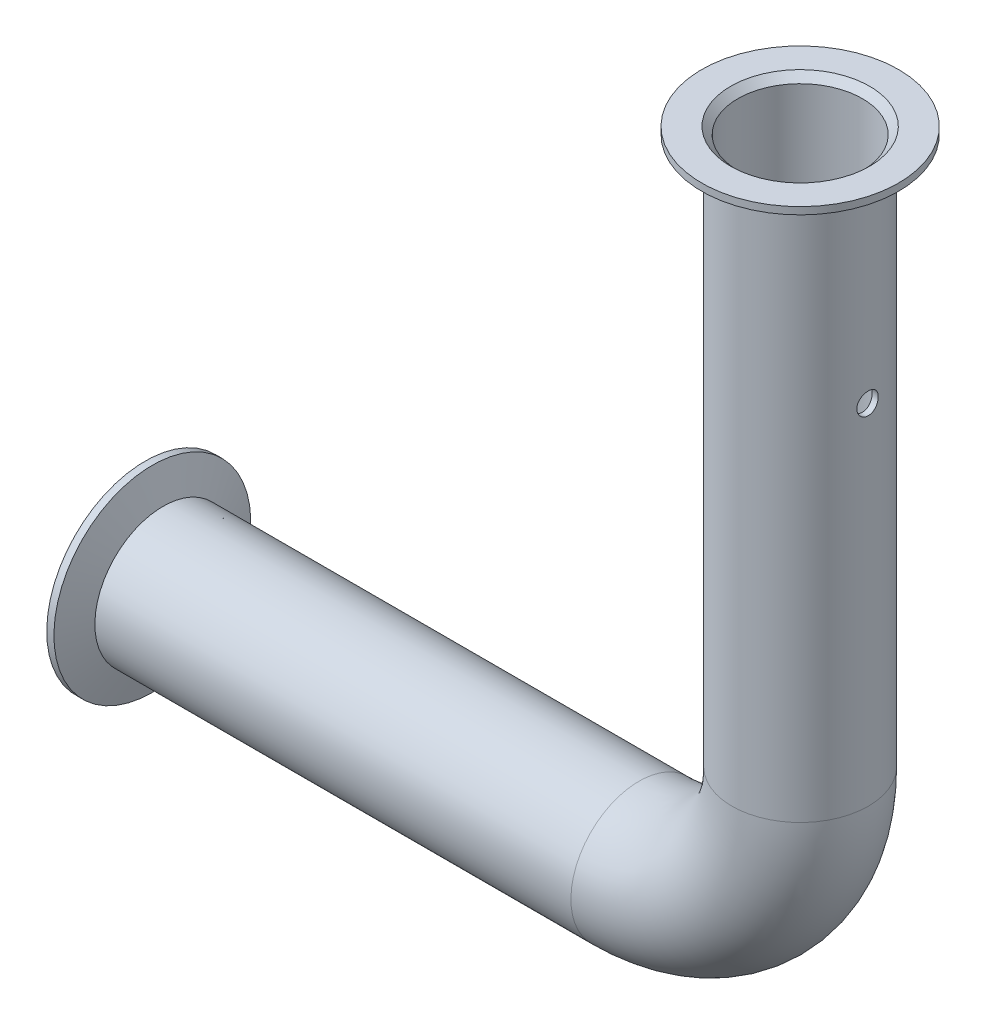
ISO-10303-21;
HEADER;
FILE_DESCRIPTION(('STEP AP214'),'2;1');
FILE_NAME('part.step','',(''),(''),'','','');
FILE_SCHEMA(('AUTOMOTIVE_DESIGN { 1 0 10303 214 1 1 1 1 }'));
ENDSEC;
DATA;
#1=APPLICATION_CONTEXT('core data for automotive mechanical design processes');
#2=APPLICATION_PROTOCOL_DEFINITION('international standard','automotive_design',2000,#1);
#3=PRODUCT_CONTEXT('',#1,'mechanical');
#4=PRODUCT('Part','Part','',(#3));
#5=PRODUCT_RELATED_PRODUCT_CATEGORY('part','',(#4));
#6=PRODUCT_DEFINITION_FORMATION('','',#4);
#7=PRODUCT_DEFINITION_CONTEXT('part definition',#1,'design');
#8=PRODUCT_DEFINITION('design','',#6,#7);
#9=PRODUCT_DEFINITION_SHAPE('','',#8);
#10=(LENGTH_UNIT() NAMED_UNIT(*) SI_UNIT(.MILLI.,.METRE.));
#11=(NAMED_UNIT(*) PLANE_ANGLE_UNIT() SI_UNIT($,.RADIAN.));
#12=(NAMED_UNIT(*) SI_UNIT($,.STERADIAN.) SOLID_ANGLE_UNIT());
#13=UNCERTAINTY_MEASURE_WITH_UNIT(LENGTH_MEASURE(1.E-05),#10,'distance_accuracy_value','');
#14=(GEOMETRIC_REPRESENTATION_CONTEXT(3) GLOBAL_UNCERTAINTY_ASSIGNED_CONTEXT((#13)) GLOBAL_UNIT_ASSIGNED_CONTEXT((#10,
#11,#12)) REPRESENTATION_CONTEXT('',''));
#15=CARTESIAN_POINT('',(0.,0.,0.));
#16=DIRECTION('',(0.,0.,1.));
#17=DIRECTION('',(1.,0.,0.));
#18=AXIS2_PLACEMENT_3D('',#15,#16,#17);
#19=CARTESIAN_POINT('',(0.,0.,0.));
#20=DIRECTION('',(1.,0.,0.));
#21=DIRECTION('',(0.,0.,-1.));
#22=AXIS2_PLACEMENT_3D('',#19,#20,#21);
#23=CYLINDRICAL_SURFACE('',#22,19.05);
#24=CARTESIAN_POINT('',(133.,0.,0.));
#25=DIRECTION('',(1.,0.,0.));
#26=DIRECTION('',(0.,0.,-1.));
#27=AXIS2_PLACEMENT_3D('',#24,#25,#26);
#28=CIRCLE('',#27,19.05);
#29=CARTESIAN_POINT('',(133.,-19.05,0.));
#30=VERTEX_POINT('',#29);
#31=EDGE_CURVE('E137',#30,#30,#28,.T.);
#32=ORIENTED_EDGE('',*,*,#31,.F.);
#33=EDGE_LOOP('',(#32));
#34=FACE_BOUND('',#33,.T.);
#35=CARTESIAN_POINT('',(0.,0.,0.));
#36=DIRECTION('',(-1.,0.,0.));
#37=DIRECTION('',(0.,-1.,0.));
#38=AXIS2_PLACEMENT_3D('',#35,#36,#37);
#39=CIRCLE('',#38,19.05);
#40=CARTESIAN_POINT('',(0.,-19.05,0.));
#41=VERTEX_POINT('',#40);
#42=EDGE_CURVE('E140',#41,#41,#39,.T.);
#43=ORIENTED_EDGE('',*,*,#42,.F.);
#44=EDGE_LOOP('',(#43));
#45=FACE_BOUND('',#44,.T.);
#46=ADVANCED_FACE('F43',(#34,#45),#23,.T.);
#47=CARTESIAN_POINT('',(133.,45.,0.));
#48=DIRECTION('',(0.,0.,1.));
#49=DIRECTION('',(1.,0.,0.));
#50=AXIS2_PLACEMENT_3D('',#47,#48,#49);
#51=TOROIDAL_SURFACE('',#50,45.,19.05);
#52=CARTESIAN_POINT('',(178.,45.,0.));
#53=DIRECTION('',(0.,1.,0.));
#54=DIRECTION('',(0.,0.,-1.));
#55=AXIS2_PLACEMENT_3D('',#52,#53,#54);
#56=CIRCLE('',#55,19.05);
#57=CARTESIAN_POINT('',(197.05,45.,0.));
#58=VERTEX_POINT('',#57);
#59=EDGE_CURVE('E133',#58,#58,#56,.T.);
#60=CARTESIAN_POINT('',(133.,45.,0.));
#61=DIRECTION('',(0.,0.,1.));
#62=DIRECTION('',(1.,0.,0.));
#63=AXIS2_PLACEMENT_3D('',#60,#61,#62);
#64=CIRCLE('',#63,64.05);
#65=EDGE_CURVE('',#30,#58,#64,.T.);
#66=ORIENTED_EDGE('',*,*,#31,.T.);
#67=ORIENTED_EDGE('',*,*,#59,.F.);
#68=ORIENTED_EDGE('',*,*,#65,.T.);
#69=ORIENTED_EDGE('',*,*,#65,.F.);
#70=EDGE_LOOP('',(#66,#68,#67,#69));
#71=FACE_BOUND('',#70,.T.);
#72=ADVANCED_FACE('F103',(#71),#51,.T.);
#73=CARTESIAN_POINT('',(178.,45.,0.));
#74=DIRECTION('',(0.,1.,0.));
#75=DIRECTION('',(0.,0.,1.));
#76=AXIS2_PLACEMENT_3D('',#73,#74,#75);
#77=CYLINDRICAL_SURFACE('',#76,19.05);
#78=CARTESIAN_POINT('',(159.187703489473,142.5,-3.));
#79=CARTESIAN_POINT('',(159.187700586577,142.332613513148,-2.99999316428225));
#80=CARTESIAN_POINT('',(159.185445263211,142.165132367923,-2.9859434783189));
#81=CARTESIAN_POINT('',(159.176674678378,141.834859918439,-2.93013500745088));
#82=CARTESIAN_POINT('',(159.170155360748,141.672073233928,-2.88834983836782));
#83=CARTESIAN_POINT('',(159.153613071349,141.356017752674,-2.77835774833509));
#84=CARTESIAN_POINT('',(159.143592893292,141.202741481065,-2.71017189064484));
#85=CARTESIAN_POINT('',(159.121181213352,140.909824846987,-2.54936485595133));
#86=CARTESIAN_POINT('',(159.108790011902,140.770182760313,-2.45674677419412));
#87=CARTESIAN_POINT('',(159.082910404004,140.507248374502,-2.24883318432544));
#88=CARTESIAN_POINT('',(159.069414117387,140.384093657118,-2.13336464402717));
#89=CARTESIAN_POINT('',(159.042915216298,140.158823383707,-1.883401654284));
#90=CARTESIAN_POINT('',(159.029912629912,140.056709023192,-1.74890612446042));
#91=CARTESIAN_POINT('',(159.005783291486,139.875906572666,-1.46382107591253));
#92=CARTESIAN_POINT('',(158.994666868924,139.797345781841,-1.31314987452316));
#93=CARTESIAN_POINT('',(158.975649841318,139.666698012562,-1.00054606276505));
#94=CARTESIAN_POINT('',(158.967749049329,139.614609495046,-0.838614107703246));
#95=CARTESIAN_POINT('',(158.956109097804,139.538803612335,-0.509504458961661));
#96=CARTESIAN_POINT('',(158.952336108274,139.514855496496,-0.342381131449638));
#97=CARTESIAN_POINT('',(158.949260803725,139.495293265373,-0.00644854828947677));
#98=CARTESIAN_POINT('',(158.949958216015,139.499677421839,0.162360603897239));
#99=CARTESIAN_POINT('',(158.955718214783,139.536474122161,0.495297170001354));
#100=CARTESIAN_POINT('',(158.960742131705,139.568638379651,0.659452789221933));
#101=CARTESIAN_POINT('',(158.974547566812,139.659691989148,0.980007386693285));
#102=CARTESIAN_POINT('',(158.983329189611,139.718582085194,1.13640614886079));
#103=CARTESIAN_POINT('',(159.003729538774,139.861666627902,1.43775322360427));
#104=CARTESIAN_POINT('',(159.015359838447,139.945964629633,1.58265155114625));
#105=CARTESIAN_POINT('',(159.040163103409,140.137396355433,1.85633969592821));
#106=CARTESIAN_POINT('',(159.05333618041,140.244531733609,1.98512834527474));
#107=CARTESIAN_POINT('',(159.079926174403,140.47997756032,2.22440636122582));
#108=CARTESIAN_POINT('',(159.093344186862,140.608504888794,2.33468230720354));
#109=CARTESIAN_POINT('',(159.118773029415,140.882352017071,2.53213541538373));
#110=CARTESIAN_POINT('',(159.130783849078,141.027671941353,2.61931240634407));
#111=CARTESIAN_POINT('',(159.15203848251,141.331212530708,2.76812750392854));
#112=CARTESIAN_POINT('',(159.161279739996,141.489444943599,2.82974203664829));
#113=CARTESIAN_POINT('',(159.175905021558,141.814190817107,2.92545981632354));
#114=CARTESIAN_POINT('',(159.181289346822,141.980703630019,2.95956521149952));
#115=CARTESIAN_POINT('',(159.187533488768,142.315380111018,2.99900048336458));
#116=CARTESIAN_POINT('',(159.188440988554,142.483507184047,3.00463363662459));
#117=CARTESIAN_POINT('',(159.185755503355,142.818303285936,2.98777075896833));
#118=CARTESIAN_POINT('',(159.182162672844,142.984972364644,2.96527569355988));
#119=CARTESIAN_POINT('',(159.17092526081,143.31117142179,2.89305274696528));
#120=CARTESIAN_POINT('',(159.163303379441,143.470736020501,2.84347738772256));
#121=CARTESIAN_POINT('',(159.14488552162,143.779291509504,2.71866034112186));
#122=CARTESIAN_POINT('',(159.134089373811,143.928281828427,2.64341726811573));
#123=CARTESIAN_POINT('',(159.11042777006,144.212814723465,2.4686776397812));
#124=CARTESIAN_POINT('',(159.097545936854,144.348235876118,2.36898562424281));
#125=CARTESIAN_POINT('',(159.071213116888,144.600535011523,2.14844821338371));
#126=CARTESIAN_POINT('',(159.057762094579,144.717411833873,2.02760149531243));
#127=CARTESIAN_POINT('',(159.031656670822,144.930401742671,1.76684593336909));
#128=CARTESIAN_POINT('',(159.019010765205,145.026313286635,1.62677148826422));
#129=CARTESIAN_POINT('',(158.996074283634,145.193242617503,1.332322319602));
#130=CARTESIAN_POINT('',(158.985783637988,145.264261141027,1.17794801936915));
#131=CARTESIAN_POINT('',(158.968754245917,145.379070102062,0.859897155614237));
#132=CARTESIAN_POINT('',(158.96200141097,145.42296866582,0.696260409581024));
#133=CARTESIAN_POINT('',(158.952749175034,145.482640779654,0.363823114579264));
#134=CARTESIAN_POINT('',(158.950249463099,145.498416385798,0.195022944026266));
#135=CARTESIAN_POINT('',(158.949788796469,145.501340666931,-0.14099902016026));
#136=CARTESIAN_POINT('',(158.951779069629,145.488796957368,-0.308218150586969));
#137=CARTESIAN_POINT('',(158.959975871122,145.436100652914,-0.638137125025831));
#138=CARTESIAN_POINT('',(158.966182381759,145.395948173898,-0.80083698800262));
#139=CARTESIAN_POINT('',(158.982117247542,145.289287189604,-1.11700004322183));
#140=CARTESIAN_POINT('',(158.991842470978,145.222802115795,-1.27047130786108));
#141=CARTESIAN_POINT('',(159.013749443631,145.065396608446,-1.56412817940785));
#142=CARTESIAN_POINT('',(159.025931288819,144.974475220239,-1.70431326696784));
#143=CARTESIAN_POINT('',(159.051556111793,144.769675110238,-1.96897416721851));
#144=CARTESIAN_POINT('',(159.065010764277,144.655570045303,-2.09327371794958));
#145=CARTESIAN_POINT('',(159.091580860866,144.408117616004,-2.32107137409755));
#146=CARTESIAN_POINT('',(159.104696224729,144.274765748005,-2.42456459735867));
#147=CARTESIAN_POINT('',(159.129190844939,143.991621612932,-2.60839822823119));
#148=CARTESIAN_POINT('',(159.140558753441,143.841731920204,-2.68859008291808));
#149=CARTESIAN_POINT('',(159.160137893067,143.530497730829,-2.82253743997057));
#150=CARTESIAN_POINT('',(159.168352345031,143.369165122282,-2.87631993177378));
#151=CARTESIAN_POINT('',(159.178829693885,143.089290764371,-2.94394424750404));
#152=CARTESIAN_POINT('',(159.18213935215,142.972463339834,-2.96493231641221));
#153=CARTESIAN_POINT('',(159.186577261681,142.737106427299,-2.99296250857308));
#154=CARTESIAN_POINT('',(159.187705545891,142.618576965033,-3.00000484243788));
#155=CARTESIAN_POINT('',(159.187703489473,142.5,-3.));
#156=B_SPLINE_CURVE_WITH_KNOTS('',3,(#78,#79,#80,#81,#82,#83,#84,#85,#86,#87,#88,#89,#90,#91,
#92,#93,#94,#95,#96,#97,#98,#99,#100,#101,#102,#103,#104,#105,#106,#107,#108,#109,#110,#111,
#112,#113,#114,#115,#116,#117,#118,#119,#120,#121,#122,#123,#124,#125,#126,#127,#128,#129,#130,
#131,#132,#133,#134,#135,#136,#137,#138,#139,#140,#141,#142,#143,#144,#145,#146,#147,#148,#149,
#150,#151,#152,#153,#154,#155),.UNSPECIFIED.,.T.,.F.,(4,2,2,2,2,2,2,2,2,2,2,2,2,2,2,2,2,2,2,2,2,
2,2,2,2,2,2,2,2,2,2,2,2,2,2,2,2,2,4),(0.,0.50172596184403,1.0039298903153,1.50573396835043,
2.00747450481917,2.51317076986734,3.01889576057936,3.52730669699158,4.03568807171937,
4.53987097764248,5.04402312901724,5.54371547542915,6.04342173399369,6.54519283818574,
7.04700029791245,7.55424551881871,8.0614945000388,8.56921023606641,9.07688632014357,
9.57914324416357,10.0813829285681,10.5808226297516,11.0802892970004,11.5838872048831,
12.0875166127364,12.5957931165224,13.1040545783955,13.6102763177623,14.1164610457681,
14.6171738846743,15.1178846220737,15.618150810642,16.1184365462134,16.6238640372158,
17.1294099875213,17.6381115698749,18.1462921895268,18.5017213609858,18.8571451646203),.UNSPECIFIED.);
#157=CARTESIAN_POINT('',(159.187703489473,142.5,-3.));
#158=VERTEX_POINT('',#157);
#159=EDGE_CURVE('E93',#158,#158,#156,.T.);
#160=ORIENTED_EDGE('',*,*,#159,.F.);
#161=EDGE_LOOP('',(#160));
#162=FACE_BOUND('',#161,.T.);
#163=CARTESIAN_POINT('',(196.812296510527,142.5,-3.));
#164=CARTESIAN_POINT('',(196.812299413423,142.667386486852,-2.99999316428225));
#165=CARTESIAN_POINT('',(196.814554736789,142.834867632077,-2.9859434783189));
#166=CARTESIAN_POINT('',(196.823325321622,143.165140081561,-2.93013500745088));
#167=CARTESIAN_POINT('',(196.829844639252,143.327926766072,-2.88834983836782));
#168=CARTESIAN_POINT('',(196.846386928651,143.643982247326,-2.77835774833509));
#169=CARTESIAN_POINT('',(196.856407106708,143.797258518935,-2.71017189064484));
#170=CARTESIAN_POINT('',(196.878818786648,144.090175153013,-2.54936485595133));
#171=CARTESIAN_POINT('',(196.891209988098,144.229817239687,-2.45674677419412));
#172=CARTESIAN_POINT('',(196.917089595996,144.492751625498,-2.24883318432544));
#173=CARTESIAN_POINT('',(196.930585882612,144.615906342882,-2.13336464402717));
#174=CARTESIAN_POINT('',(196.957084783702,144.841176616293,-1.883401654284));
#175=CARTESIAN_POINT('',(196.970087370088,144.943290976808,-1.74890612446042));
#176=CARTESIAN_POINT('',(196.994216708514,145.124093427334,-1.46382107591253));
#177=CARTESIAN_POINT('',(197.005333131076,145.202654218159,-1.31314987452315));
#178=CARTESIAN_POINT('',(197.024350158682,145.333301987438,-1.00054606276505));
#179=CARTESIAN_POINT('',(197.032250950671,145.385390504954,-0.838614107703245));
#180=CARTESIAN_POINT('',(197.043890902196,145.461196387665,-0.509504458961662));
#181=CARTESIAN_POINT('',(197.047663891726,145.485144503504,-0.342381131449638));
#182=CARTESIAN_POINT('',(197.050739196275,145.504706734627,-0.00644854828947655));
#183=CARTESIAN_POINT('',(197.050041783985,145.500322578161,0.162360603897239));
#184=CARTESIAN_POINT('',(197.044281785217,145.463525877839,0.495297170001354));
#185=CARTESIAN_POINT('',(197.039257868295,145.431361620349,0.659452789221933));
#186=CARTESIAN_POINT('',(197.025452433188,145.340308010852,0.980007386693285));
#187=CARTESIAN_POINT('',(197.016670810389,145.281417914806,1.13640614886079));
#188=CARTESIAN_POINT('',(196.996270461226,145.138333372098,1.43775322360427));
#189=CARTESIAN_POINT('',(196.984640161553,145.054035370367,1.58265155114625));
#190=CARTESIAN_POINT('',(196.959836896591,144.862603644567,1.85633969592821));
#191=CARTESIAN_POINT('',(196.94666381959,144.755468266391,1.98512834527474));
#192=CARTESIAN_POINT('',(196.920073825597,144.520022439681,2.22440636122582));
#193=CARTESIAN_POINT('',(196.906655813138,144.391495111206,2.33468230720354));
#194=CARTESIAN_POINT('',(196.881226970585,144.117647982929,2.53213541538373));
#195=CARTESIAN_POINT('',(196.869216150922,143.972328058647,2.61931240634407));
#196=CARTESIAN_POINT('',(196.84796151749,143.668787469292,2.76812750392854));
#197=CARTESIAN_POINT('',(196.838720260004,143.510555056401,2.82974203664829));
#198=CARTESIAN_POINT('',(196.824094978442,143.185809182893,2.92545981632354));
#199=CARTESIAN_POINT('',(196.818710653178,143.019296369981,2.95956521149952));
#200=CARTESIAN_POINT('',(196.812466511232,142.684619888982,2.99900048336458));
#201=CARTESIAN_POINT('',(196.811559011446,142.516492815953,3.00463363662459));
#202=CARTESIAN_POINT('',(196.814244496645,142.181696714064,2.98777075896833));
#203=CARTESIAN_POINT('',(196.817837327156,142.015027635356,2.96527569355988));
#204=CARTESIAN_POINT('',(196.82907473919,141.68882857821,2.89305274696528));
#205=CARTESIAN_POINT('',(196.836696620559,141.529263979499,2.84347738772256));
#206=CARTESIAN_POINT('',(196.85511447838,141.220708490496,2.71866034112186));
#207=CARTESIAN_POINT('',(196.865910626189,141.071718171573,2.64341726811573));
#208=CARTESIAN_POINT('',(196.88957222994,140.787185276535,2.4686776397812));
#209=CARTESIAN_POINT('',(196.902454063146,140.651764123882,2.36898562424281));
#210=CARTESIAN_POINT('',(196.928786883112,140.399464988477,2.14844821338371));
#211=CARTESIAN_POINT('',(196.942237905421,140.282588166127,2.02760149531243));
#212=CARTESIAN_POINT('',(196.968343329178,140.06959825733,1.76684593336909));
#213=CARTESIAN_POINT('',(196.980989234795,139.973686713365,1.62677148826422));
#214=CARTESIAN_POINT('',(197.003925716366,139.806757382497,1.332322319602));
#215=CARTESIAN_POINT('',(197.014216362012,139.735738858973,1.17794801936915));
#216=CARTESIAN_POINT('',(197.031245754083,139.620929897938,0.859897155614237));
#217=CARTESIAN_POINT('',(197.03799858903,139.57703133418,0.696260409581024));
#218=CARTESIAN_POINT('',(197.047250824966,139.517359220346,0.363823114579264));
#219=CARTESIAN_POINT('',(197.049750536901,139.501583614202,0.195022944026266));
#220=CARTESIAN_POINT('',(197.050211203531,139.498659333069,-0.14099902016026));
#221=CARTESIAN_POINT('',(197.048220930371,139.511203042632,-0.308218150586969));
#222=CARTESIAN_POINT('',(197.040024128878,139.563899347086,-0.638137125025831));
#223=CARTESIAN_POINT('',(197.033817618241,139.604051826102,-0.80083698800262));
#224=CARTESIAN_POINT('',(197.017882752458,139.710712810396,-1.11700004322183));
#225=CARTESIAN_POINT('',(197.008157529022,139.777197884205,-1.27047130786108));
#226=CARTESIAN_POINT('',(196.986250556369,139.934603391554,-1.56412817940785));
#227=CARTESIAN_POINT('',(196.974068711181,140.025524779761,-1.70431326696784));
#228=CARTESIAN_POINT('',(196.948443888207,140.230324889762,-1.96897416721851));
#229=CARTESIAN_POINT('',(196.934989235723,140.344429954697,-2.09327371794958));
#230=CARTESIAN_POINT('',(196.908419139134,140.591882383996,-2.32107137409755));
#231=CARTESIAN_POINT('',(196.895303775271,140.725234251995,-2.42456459735867));
#232=CARTESIAN_POINT('',(196.870809155061,141.008378387068,-2.60839822823119));
#233=CARTESIAN_POINT('',(196.859441246559,141.158268079796,-2.68859008291808));
#234=CARTESIAN_POINT('',(196.839862106933,141.469502269171,-2.82253743997057));
#235=CARTESIAN_POINT('',(196.831647654969,141.630834877718,-2.87631993177378));
#236=CARTESIAN_POINT('',(196.821170306115,141.910709235629,-2.94394424750404));
#237=CARTESIAN_POINT('',(196.81786064785,142.027536660166,-2.96493231641221));
#238=CARTESIAN_POINT('',(196.813422738319,142.262893572701,-2.99296250857308));
#239=CARTESIAN_POINT('',(196.812294454109,142.381423034967,-3.00000484243788));
#240=CARTESIAN_POINT('',(196.812296510527,142.5,-3.));
#241=B_SPLINE_CURVE_WITH_KNOTS('',3,(#163,#164,#165,#166,#167,#168,#169,#170,#171,#172,#173,
#174,#175,#176,#177,#178,#179,#180,#181,#182,#183,#184,#185,#186,#187,#188,#189,#190,#191,#192,
#193,#194,#195,#196,#197,#198,#199,#200,#201,#202,#203,#204,#205,#206,#207,#208,#209,#210,#211,
#212,#213,#214,#215,#216,#217,#218,#219,#220,#221,#222,#223,#224,#225,#226,#227,#228,#229,#230,
#231,#232,#233,#234,#235,#236,#237,#238,#239,#240),.UNSPECIFIED.,.T.,.F.,(4,2,2,2,2,2,2,2,2,2,2,
2,2,2,2,2,2,2,2,2,2,2,2,2,2,2,2,2,2,2,2,2,2,2,2,2,2,2,4),(0.,0.50172596184403,1.0039298903153,
1.50573396835043,2.00747450481917,2.51317076986734,3.01889576057936,3.52730669699159,
4.03568807171937,4.53987097764248,5.04402312901724,5.54371547542915,6.04342173399369,
6.54519283818574,7.04700029791245,7.55424551881871,8.06149450003881,8.56921023606641,
9.07688632014357,9.57914324416358,10.0813829285681,10.5808226297516,11.0802892970004,
11.5838872048831,12.0875166127364,12.5957931165224,13.1040545783955,13.6102763177623,
14.1164610457681,14.6171738846743,15.1178846220737,15.6181508106421,16.1184365462134,
16.6238640372158,17.1294099875213,17.6381115698749,18.1462921895268,18.5017213609858,
18.8571451646203),.UNSPECIFIED.);
#242=CARTESIAN_POINT('',(196.812296510527,142.5,-3.));
#243=VERTEX_POINT('',#242);
#244=EDGE_CURVE('E87',#243,#243,#241,.T.);
#245=ORIENTED_EDGE('',*,*,#244,.F.);
#246=EDGE_LOOP('',(#245));
#247=FACE_BOUND('',#246,.T.);
#248=CARTESIAN_POINT('',(178.,195.,0.));
#249=DIRECTION('',(0.,1.,0.));
#250=DIRECTION('',(0.,0.,-1.));
#251=AXIS2_PLACEMENT_3D('',#248,#249,#250);
#252=CIRCLE('',#251,19.05);
#253=CARTESIAN_POINT('',(178.,195.,-19.05));
#254=VERTEX_POINT('',#253);
#255=EDGE_CURVE('E136',#254,#254,#252,.T.);
#256=ORIENTED_EDGE('',*,*,#255,.F.);
#257=EDGE_LOOP('',(#256));
#258=FACE_BOUND('',#257,.T.);
#259=ORIENTED_EDGE('',*,*,#59,.T.);
#260=EDGE_LOOP('',(#259));
#261=FACE_BOUND('',#260,.T.);
#262=ADVANCED_FACE('F98',(#162,#247,#258,#261),#77,.T.);
#263=CARTESIAN_POINT('',(0.,0.,0.));
#264=DIRECTION('',(-1.,0.,0.));
#265=DIRECTION('',(0.,-1.,0.));
#266=AXIS2_PLACEMENT_3D('',#263,#264,#265);
#267=CONICAL_SURFACE('',#266,19.05,1.2296478530425);
#268=CARTESIAN_POINT('',(-3.,0.,0.));
#269=DIRECTION('',(-1.,0.,0.));
#270=DIRECTION('',(0.,-1.,0.));
#271=AXIS2_PLACEMENT_3D('',#268,#269,#270);
#272=CIRCLE('',#271,27.5);
#273=CARTESIAN_POINT('',(-3.,-27.5,0.));
#274=VERTEX_POINT('',#273);
#275=EDGE_CURVE('E147',#274,#274,#272,.T.);
#276=ORIENTED_EDGE('',*,*,#275,.F.);
#277=EDGE_LOOP('',(#276));
#278=FACE_BOUND('',#277,.T.);
#279=ORIENTED_EDGE('',*,*,#42,.T.);
#280=EDGE_LOOP('',(#279));
#281=FACE_BOUND('',#280,.T.);
#282=ADVANCED_FACE('F102',(#278,#281),#267,.T.);
#283=CARTESIAN_POINT('',(-5.,0.,0.));
#284=DIRECTION('',(-1.,0.,0.));
#285=DIRECTION('',(0.,-1.,0.));
#286=AXIS2_PLACEMENT_3D('',#283,#284,#285);
#287=CYLINDRICAL_SURFACE('',#286,27.5);
#288=CARTESIAN_POINT('',(-5.,0.,0.));
#289=DIRECTION('',(-1.,0.,0.));
#290=DIRECTION('',(0.,-1.,0.));
#291=AXIS2_PLACEMENT_3D('',#288,#289,#290);
#292=CIRCLE('',#291,27.5);
#293=CARTESIAN_POINT('',(-5.,-27.5,0.));
#294=VERTEX_POINT('',#293);
#295=EDGE_CURVE('E150',#294,#294,#292,.T.);
#296=ORIENTED_EDGE('',*,*,#295,.F.);
#297=EDGE_LOOP('',(#296));
#298=FACE_BOUND('',#297,.T.);
#299=ORIENTED_EDGE('',*,*,#275,.T.);
#300=EDGE_LOOP('',(#299));
#301=FACE_BOUND('',#300,.T.);
#302=ADVANCED_FACE('F179',(#298,#301),#287,.T.);
#303=CARTESIAN_POINT('',(-5.,27.5,0.));
#304=DIRECTION('',(1.,0.,0.));
#305=DIRECTION('',(0.,1.,0.));
#306=AXIS2_PLACEMENT_3D('',#303,#304,#305);
#307=PLANE('',#306);
#308=CARTESIAN_POINT('',(-5.,0.,0.));
#309=DIRECTION('',(1.,0.,0.));
#310=DIRECTION('',(0.,1.,0.));
#311=AXIS2_PLACEMENT_3D('',#308,#309,#310);
#312=CIRCLE('',#311,19.4);
#313=CARTESIAN_POINT('',(-5.,19.4,0.));
#314=VERTEX_POINT('',#313);
#315=EDGE_CURVE('E62',#314,#314,#312,.T.);
#316=ORIENTED_EDGE('',*,*,#315,.T.);
#317=EDGE_LOOP('',(#316));
#318=FACE_BOUND('',#317,.T.);
#319=ORIENTED_EDGE('',*,*,#295,.T.);
#320=EDGE_LOOP('',(#319));
#321=FACE_BOUND('',#320,.T.);
#322=ADVANCED_FACE('F186',(#318,#321),#307,.F.);
#323=CARTESIAN_POINT('',(178.,200.,0.));
#324=DIRECTION('',(0.,1.,0.));
#325=DIRECTION('',(0.,0.,1.));
#326=AXIS2_PLACEMENT_3D('',#323,#324,#325);
#327=PLANE('',#326);
#328=CARTESIAN_POINT('',(178.,200.,0.));
#329=DIRECTION('',(0.,1.,0.));
#330=DIRECTION('',(0.,0.,1.));
#331=AXIS2_PLACEMENT_3D('',#328,#329,#330);
#332=CIRCLE('',#331,19.4000000000001);
#333=CARTESIAN_POINT('',(178.,200.,19.4000000000001));
#334=VERTEX_POINT('',#333);
#335=EDGE_CURVE('E10',#334,#334,#332,.F.);
#336=ORIENTED_EDGE('',*,*,#335,.T.);
#337=EDGE_LOOP('',(#336));
#338=FACE_BOUND('',#337,.T.);
#339=CARTESIAN_POINT('',(178.,200.,0.));
#340=DIRECTION('',(0.,-1.,0.));
#341=DIRECTION('',(0.,0.,-1.));
#342=AXIS2_PLACEMENT_3D('',#339,#340,#341);
#343=CIRCLE('',#342,27.5);
#344=CARTESIAN_POINT('',(178.,200.,-27.5));
#345=VERTEX_POINT('',#344);
#346=EDGE_CURVE('E153',#345,#345,#343,.T.);
#347=ORIENTED_EDGE('',*,*,#346,.F.);
#348=EDGE_LOOP('',(#347));
#349=FACE_BOUND('',#348,.T.);
#350=ADVANCED_FACE('F248',(#338,#349),#327,.T.);
#351=CARTESIAN_POINT('',(178.,195.,0.));
#352=DIRECTION('',(0.,-1.,0.));
#353=DIRECTION('',(0.,0.,-1.));
#354=AXIS2_PLACEMENT_3D('',#351,#352,#353);
#355=CYLINDRICAL_SURFACE('',#354,27.5);
#356=ORIENTED_EDGE('',*,*,#346,.T.);
#357=EDGE_LOOP('',(#356));
#358=FACE_BOUND('',#357,.T.);
#359=CARTESIAN_POINT('',(178.,198.,0.));
#360=DIRECTION('',(0.,-1.,0.));
#361=DIRECTION('',(0.,0.,-1.));
#362=AXIS2_PLACEMENT_3D('',#359,#360,#361);
#363=CIRCLE('',#362,27.5);
#364=CARTESIAN_POINT('',(178.,198.,-27.5));
#365=VERTEX_POINT('',#364);
#366=EDGE_CURVE('E155',#365,#365,#363,.T.);
#367=ORIENTED_EDGE('',*,*,#366,.F.);
#368=EDGE_LOOP('',(#367));
#369=FACE_BOUND('',#368,.T.);
#370=ADVANCED_FACE('F256',(#358,#369),#355,.T.);
#371=CARTESIAN_POINT('',(178.,195.,0.));
#372=DIRECTION('',(0.,1.,0.));
#373=DIRECTION('',(0.,0.,1.));
#374=AXIS2_PLACEMENT_3D('',#371,#372,#373);
#375=CONICAL_SURFACE('',#374,19.05,1.2296478530425);
#376=ORIENTED_EDGE('',*,*,#366,.T.);
#377=EDGE_LOOP('',(#376));
#378=FACE_BOUND('',#377,.T.);
#379=ORIENTED_EDGE('',*,*,#255,.T.);
#380=EDGE_LOOP('',(#379));
#381=FACE_BOUND('',#380,.T.);
#382=ADVANCED_FACE('F80',(#378,#381),#375,.T.);
#383=CARTESIAN_POINT('',(0.,0.,0.));
#384=DIRECTION('',(1.,0.,0.));
#385=DIRECTION('',(0.,0.,-1.));
#386=AXIS2_PLACEMENT_3D('',#383,#384,#385);
#387=CYLINDRICAL_SURFACE('',#386,17.4);
#388=CARTESIAN_POINT('',(-3.00000000000002,0.,0.));
#389=DIRECTION('',(1.,0.,0.));
#390=DIRECTION('',(0.,0.,-1.));
#391=AXIS2_PLACEMENT_3D('',#388,#389,#390);
#392=CIRCLE('',#391,17.4);
#393=CARTESIAN_POINT('',(-3.00000000000002,0.,-17.4));
#394=VERTEX_POINT('',#393);
#395=EDGE_CURVE('E125',#394,#394,#392,.F.);
#396=ORIENTED_EDGE('',*,*,#395,.T.);
#397=EDGE_LOOP('',(#396));
#398=FACE_BOUND('',#397,.T.);
#399=CARTESIAN_POINT('',(133.,0.,0.));
#400=DIRECTION('',(1.,0.,0.));
#401=DIRECTION('',(0.,0.,-1.));
#402=AXIS2_PLACEMENT_3D('',#399,#400,#401);
#403=CIRCLE('',#402,17.4);
#404=CARTESIAN_POINT('',(133.,-17.4,0.));
#405=VERTEX_POINT('',#404);
#406=EDGE_CURVE('E130',#405,#405,#403,.F.);
#407=ORIENTED_EDGE('',*,*,#406,.F.);
#408=EDGE_LOOP('',(#407));
#409=FACE_BOUND('',#408,.T.);
#410=ADVANCED_FACE('F192',(#398,#409),#387,.F.);
#411=CARTESIAN_POINT('',(133.,45.,0.));
#412=DIRECTION('',(0.,0.,1.));
#413=DIRECTION('',(1.,0.,0.));
#414=AXIS2_PLACEMENT_3D('',#411,#412,#413);
#415=TOROIDAL_SURFACE('',#414,45.,17.4);
#416=CARTESIAN_POINT('',(178.,45.,0.));
#417=DIRECTION('',(0.,1.,0.));
#418=DIRECTION('',(0.,0.,-1.));
#419=AXIS2_PLACEMENT_3D('',#416,#417,#418);
#420=CIRCLE('',#419,17.4);
#421=CARTESIAN_POINT('',(195.4,45.,0.));
#422=VERTEX_POINT('',#421);
#423=EDGE_CURVE('E127',#422,#422,#420,.F.);
#424=CARTESIAN_POINT('',(133.,45.,0.));
#425=DIRECTION('',(0.,0.,1.));
#426=DIRECTION('',(1.,0.,0.));
#427=AXIS2_PLACEMENT_3D('',#424,#425,#426);
#428=CIRCLE('',#427,62.4);
#429=EDGE_CURVE('',#405,#422,#428,.T.);
#430=ORIENTED_EDGE('',*,*,#406,.T.);
#431=ORIENTED_EDGE('',*,*,#423,.F.);
#432=ORIENTED_EDGE('',*,*,#429,.T.);
#433=ORIENTED_EDGE('',*,*,#429,.F.);
#434=EDGE_LOOP('',(#430,#432,#431,#433));
#435=FACE_BOUND('',#434,.T.);
#436=ADVANCED_FACE('F118',(#435),#415,.F.);
#437=CARTESIAN_POINT('',(178.,45.,0.));
#438=DIRECTION('',(0.,1.,0.));
#439=DIRECTION('',(0.,0.,1.));
#440=AXIS2_PLACEMENT_3D('',#437,#438,#439);
#441=CYLINDRICAL_SURFACE('',#440,17.4);
#442=CARTESIAN_POINT('',(160.860571771497,142.5,-3.));
#443=CARTESIAN_POINT('',(160.860568686313,142.667162099753,-2.99999335724504));
#444=CARTESIAN_POINT('',(160.858099737712,142.834413351142,-2.98598107648695));
#445=CARTESIAN_POINT('',(160.848500572209,143.164216925406,-2.93033007499266));
#446=CARTESIAN_POINT('',(160.841366147984,143.326764868545,-2.88866641776324));
#447=CARTESIAN_POINT('',(160.823267544719,143.642341389074,-2.7790156991738));
#448=CARTESIAN_POINT('',(160.812306663912,143.795378031374,-2.71105130240584));
#449=CARTESIAN_POINT('',(160.787794060499,144.087861493786,-2.55078581397659));
#450=CARTESIAN_POINT('',(160.774242605691,144.227309716336,-2.45848723745745));
#451=CARTESIAN_POINT('',(160.745916174486,144.490142716688,-2.25113587305086));
#452=CARTESIAN_POINT('',(160.731130858211,144.613363478061,-2.13587656578704));
#453=CARTESIAN_POINT('',(160.702094345869,144.838817984968,-1.88632186548368));
#454=CARTESIAN_POINT('',(160.687843182379,144.94105045219,-1.75202531380507));
#455=CARTESIAN_POINT('',(160.661370897769,145.122245465277,-1.46714159110158));
#456=CARTESIAN_POINT('',(160.649163359464,145.201054820499,-1.31645561601985));
#457=CARTESIAN_POINT('',(160.628269031425,145.332181245278,-1.00373804855049));
#458=CARTESIAN_POINT('',(160.619581996853,145.384500157219,-0.841707246076585));
#459=CARTESIAN_POINT('',(160.606780474774,145.460657399248,-0.51259550662226));
#460=CARTESIAN_POINT('',(160.602621728107,145.484771576181,-0.345580151005187));
#461=CARTESIAN_POINT('',(160.599193166443,145.504693060338,-0.00982576970067351));
#462=CARTESIAN_POINT('',(160.599922996891,145.500502420442,0.158913130095934));
#463=CARTESIAN_POINT('',(160.606154440519,145.464147406612,0.49143718158875));
#464=CARTESIAN_POINT('',(160.611605405862,145.432279936818,0.655255879179156));
#465=CARTESIAN_POINT('',(160.626610099872,145.341943926314,0.975185404226671));
#466=CARTESIAN_POINT('',(160.636163960259,145.28347453157,1.13129598404231));
#467=CARTESIAN_POINT('',(160.658386802691,145.141302573686,1.43225507453539));
#468=CARTESIAN_POINT('',(160.671070713055,145.057478640159,1.57704510303452));
#469=CARTESIAN_POINT('',(160.698146145566,144.867066107597,1.8506157652878));
#470=CARTESIAN_POINT('',(160.712537815308,144.760475540292,1.97939501332025));
#471=CARTESIAN_POINT('',(160.741650395029,144.525911473752,2.21904409806251));
#472=CARTESIAN_POINT('',(160.756373153874,144.397678399926,2.32965979374928));
#473=CARTESIAN_POINT('',(160.784308467518,144.124341347122,2.5278474786494));
#474=CARTESIAN_POINT('',(160.797521006423,143.979237190615,2.61541922534721));
#475=CARTESIAN_POINT('',(160.820941345576,143.675971086589,2.76508902583851));
#476=CARTESIAN_POINT('',(160.831145335155,143.517792901075,2.82715481227661));
#477=CARTESIAN_POINT('',(160.847331537515,143.193040148825,2.92376252990049));
#478=CARTESIAN_POINT('',(160.853314149851,143.026466378336,2.95830706603273));
#479=CARTESIAN_POINT('',(160.860302432344,142.691929471287,2.9985303541063));
#480=CARTESIAN_POINT('',(160.861370690698,142.524011250249,3.00457213668238));
#481=CARTESIAN_POINT('',(160.858576225316,142.189563602633,2.98858735020478));
#482=CARTESIAN_POINT('',(160.85471370602,142.023034118763,2.96656194487535));
#483=CARTESIAN_POINT('',(160.842550845552,141.697254911017,2.89537809899298));
#484=CARTESIAN_POINT('',(160.834280978182,141.537963253417,2.84640590248255));
#485=CARTESIAN_POINT('',(160.814260977332,141.229847294372,2.72291454529328));
#486=CARTESIAN_POINT('',(160.802510622625,141.081023659035,2.64839376065669));
#487=CARTESIAN_POINT('',(160.776708953608,140.796456929061,2.47506944224903));
#488=CARTESIAN_POINT('',(160.762636132057,140.660856984217,2.37603414278919));
#489=CARTESIAN_POINT('',(160.733837438016,140.40806986812,2.15680866369819));
#490=CARTESIAN_POINT('',(160.719111516299,140.290884087833,2.03661688740501));
#491=CARTESIAN_POINT('',(160.690467048021,140.07691803837,1.77687839501271));
#492=CARTESIAN_POINT('',(160.676559362151,139.980380420645,1.63713040748836));
#493=CARTESIAN_POINT('',(160.6512948006,139.812154077889,1.34318887931082));
#494=CARTESIAN_POINT('',(160.639937838026,139.740464506338,1.18899583099853));
#495=CARTESIAN_POINT('',(160.621101417702,139.624343085256,0.871248610545507));
#496=CARTESIAN_POINT('',(160.613604217505,139.579786336223,0.707741180390293));
#497=CARTESIAN_POINT('',(160.603256859068,139.518794058127,0.375423922002362));
#498=CARTESIAN_POINT('',(160.600406290437,139.502356045603,0.206614563379787));
#499=CARTESIAN_POINT('',(160.599679801816,139.498143301673,-0.129176685642755));
#500=CARTESIAN_POINT('',(160.601739932249,139.510000103339,-0.296153928928437));
#501=CARTESIAN_POINT('',(160.61047220223,139.561240787417,-0.625700411283112));
#502=CARTESIAN_POINT('',(160.617144311415,139.600624488607,-0.788269679364498));
#503=CARTESIAN_POINT('',(160.634352935991,139.705655848456,-1.10423036972656));
#504=CARTESIAN_POINT('',(160.644884530097,139.771270069836,-1.2576331918238));
#505=CARTESIAN_POINT('',(160.668665022481,139.926858125833,-1.55130884583338));
#506=CARTESIAN_POINT('',(160.681914064025,140.016833244852,-1.69158098491987));
#507=CARTESIAN_POINT('',(160.709866551659,140.21988534551,-1.95686448300168));
#508=CARTESIAN_POINT('',(160.724585794082,140.333231232456,-2.08166837611875));
#509=CARTESIAN_POINT('',(160.753712987405,140.579244455275,-2.3106140598353));
#510=CARTESIAN_POINT('',(160.768120864561,140.711916311962,-2.41475100243274));
#511=CARTESIAN_POINT('',(160.795113177188,140.994020773316,-2.60014194329311));
#512=CARTESIAN_POINT('',(160.807682855311,141.14357357989,-2.68121521383318));
#513=CARTESIAN_POINT('',(160.829400451144,141.454334860905,-2.81696232305056));
#514=CARTESIAN_POINT('',(160.838551735728,141.615531679031,-2.87166215322099));
#515=CARTESIAN_POINT('',(160.850398678111,141.897764938873,-2.94143011247902));
#516=CARTESIAN_POINT('',(160.854192000948,142.017106496306,-2.96335795827201));
#517=CARTESIAN_POINT('',(160.859279640824,142.257616434661,-2.9926451623756));
#518=CARTESIAN_POINT('',(160.860574008675,142.378784778388,-3.00000481689939));
#519=CARTESIAN_POINT('',(160.860571771497,142.5,-3.));
#520=B_SPLINE_CURVE_WITH_KNOTS('',3,(#442,#443,#444,#445,#446,#447,#448,#449,#450,#451,#452,
#453,#454,#455,#456,#457,#458,#459,#460,#461,#462,#463,#464,#465,#466,#467,#468,#469,#470,#471,
#472,#473,#474,#475,#476,#477,#478,#479,#480,#481,#482,#483,#484,#485,#486,#487,#488,#489,#490,
#491,#492,#493,#494,#495,#496,#497,#498,#499,#500,#501,#502,#503,#504,#505,#506,#507,#508,#509,
#510,#511,#512,#513,#514,#515,#516,#517,#518,#519),.UNSPECIFIED.,.T.,.F.,(4,2,2,2,2,2,2,2,2,2,2,
2,2,2,2,2,2,2,2,2,2,2,2,2,2,2,2,2,2,2,2,2,2,2,2,2,2,2,4),(0.,0.501042953696751,1.00253837175682,
1.50360258640457,2.00461503214071,2.51035571628729,3.0161271938978,3.52513716675678,
4.03411173362187,4.53806568381936,5.0419830838396,5.54056054503626,6.03915401380184,
6.54017303647854,7.04123539185443,7.54880106706893,8.05637208371345,8.56458326156783,
9.07274633040744,9.57441928796094,10.0760714457824,10.5742991854241,11.0725586000396,
11.5757217380416,12.0789228656482,12.587746951808,13.0965537016737,13.6030002173402,
14.1094020010937,14.609245269603,15.1090852474469,15.6082900772057,16.1075212321217,
16.612853860736,17.1183048892756,17.6276139203982,18.1364199872441,18.4997515539939,
18.8630757330934),.UNSPECIFIED.);
#521=CARTESIAN_POINT('',(160.860571771497,142.5,-3.));
#522=VERTEX_POINT('',#521);
#523=EDGE_CURVE('E48',#522,#522,#520,.T.);
#524=ORIENTED_EDGE('',*,*,#523,.F.);
#525=EDGE_LOOP('',(#524));
#526=FACE_BOUND('',#525,.T.);
#527=CARTESIAN_POINT('',(195.139428228503,142.5,-3.));
#528=CARTESIAN_POINT('',(195.139431313687,142.332837900247,-2.99999335724504));
#529=CARTESIAN_POINT('',(195.141900262288,142.165586648858,-2.98598107648695));
#530=CARTESIAN_POINT('',(195.151499427791,141.835783074594,-2.93033007499266));
#531=CARTESIAN_POINT('',(195.158633852016,141.673235131455,-2.88866641776324));
#532=CARTESIAN_POINT('',(195.176732455281,141.357658610927,-2.7790156991738));
#533=CARTESIAN_POINT('',(195.187693336088,141.204621968626,-2.71105130240584));
#534=CARTESIAN_POINT('',(195.212205939501,140.912138506214,-2.55078581397659));
#535=CARTESIAN_POINT('',(195.225757394309,140.772690283664,-2.45848723745745));
#536=CARTESIAN_POINT('',(195.254083825514,140.509857283312,-2.25113587305086));
#537=CARTESIAN_POINT('',(195.268869141789,140.386636521939,-2.13587656578704));
#538=CARTESIAN_POINT('',(195.297905654131,140.161182015032,-1.88632186548368));
#539=CARTESIAN_POINT('',(195.312156817621,140.05894954781,-1.75202531380507));
#540=CARTESIAN_POINT('',(195.338629102231,139.877754534723,-1.46714159110158));
#541=CARTESIAN_POINT('',(195.350836640536,139.798945179501,-1.31645561601985));
#542=CARTESIAN_POINT('',(195.371730968575,139.667818754722,-1.00373804855049));
#543=CARTESIAN_POINT('',(195.380418003147,139.615499842781,-0.841707246076585));
#544=CARTESIAN_POINT('',(195.393219525226,139.539342600752,-0.51259550662226));
#545=CARTESIAN_POINT('',(195.397378271893,139.515228423819,-0.345580151005187));
#546=CARTESIAN_POINT('',(195.400806833557,139.495306939662,-0.00982576970067349));
#547=CARTESIAN_POINT('',(195.400077003109,139.499497579558,0.158913130095934));
#548=CARTESIAN_POINT('',(195.393845559481,139.535852593388,0.491437181588748));
#549=CARTESIAN_POINT('',(195.388394594138,139.567720063182,0.655255879179151));
#550=CARTESIAN_POINT('',(195.373389900128,139.658056073686,0.975185404226666));
#551=CARTESIAN_POINT('',(195.363836039741,139.71652546843,1.13129598404231));
#552=CARTESIAN_POINT('',(195.341613197309,139.858697426314,1.43225507453539));
#553=CARTESIAN_POINT('',(195.328929286945,139.942521359841,1.57704510303452));
#554=CARTESIAN_POINT('',(195.301853854434,140.132933892403,1.8506157652878));
#555=CARTESIAN_POINT('',(195.287462184692,140.239524459708,1.97939501332025));
#556=CARTESIAN_POINT('',(195.258349604971,140.474088526248,2.21904409806252));
#557=CARTESIAN_POINT('',(195.243626846126,140.602321600074,2.32965979374929));
#558=CARTESIAN_POINT('',(195.215691532482,140.875658652878,2.52784747864941));
#559=CARTESIAN_POINT('',(195.202478993577,141.020762809385,2.61541922534722));
#560=CARTESIAN_POINT('',(195.179058654424,141.324028913411,2.76508902583851));
#561=CARTESIAN_POINT('',(195.168854664845,141.482207098925,2.82715481227661));
#562=CARTESIAN_POINT('',(195.152668462485,141.806959851175,2.92376252990049));
#563=CARTESIAN_POINT('',(195.146685850149,141.973533621664,2.95830706603273));
#564=CARTESIAN_POINT('',(195.139697567656,142.308070528713,2.9985303541063));
#565=CARTESIAN_POINT('',(195.138629309302,142.475988749751,3.00457213668238));
#566=CARTESIAN_POINT('',(195.141423774684,142.810436397367,2.98858735020478));
#567=CARTESIAN_POINT('',(195.14528629398,142.976965881237,2.96656194487535));
#568=CARTESIAN_POINT('',(195.157449154448,143.302745088983,2.89537809899298));
#569=CARTESIAN_POINT('',(195.165719021817,143.462036746583,2.84640590248255));
#570=CARTESIAN_POINT('',(195.185739022668,143.770152705628,2.72291454529328));
#571=CARTESIAN_POINT('',(195.197489377375,143.918976340965,2.64839376065669));
#572=CARTESIAN_POINT('',(195.223291046392,144.20354307094,2.47506944224903));
#573=CARTESIAN_POINT('',(195.237363867943,144.339143015783,2.37603414278919));
#574=CARTESIAN_POINT('',(195.266162561984,144.59193013188,2.15680866369819));
#575=CARTESIAN_POINT('',(195.280888483701,144.709115912167,2.036616887405));
#576=CARTESIAN_POINT('',(195.309532951979,144.92308196163,1.7768783950127));
#577=CARTESIAN_POINT('',(195.323440637849,145.019619579356,1.63713040748834));
#578=CARTESIAN_POINT('',(195.3487051994,145.187845922111,1.3431888793108));
#579=CARTESIAN_POINT('',(195.360062161974,145.259535493662,1.18899583099852));
#580=CARTESIAN_POINT('',(195.378898582298,145.375656914744,0.871248610545506));
#581=CARTESIAN_POINT('',(195.386395782495,145.420213663777,0.707741180390292));
#582=CARTESIAN_POINT('',(195.396743140932,145.481205941873,0.375423922002363));
#583=CARTESIAN_POINT('',(195.399593709563,145.497643954397,0.206614563379787));
#584=CARTESIAN_POINT('',(195.400320198184,145.501856698327,-0.129176685642755));
#585=CARTESIAN_POINT('',(195.398260067751,145.489999896661,-0.296153928928437));
#586=CARTESIAN_POINT('',(195.38952779777,145.438759212583,-0.625700411283112));
#587=CARTESIAN_POINT('',(195.382855688585,145.399375511393,-0.788269679364498));
#588=CARTESIAN_POINT('',(195.365647064009,145.294344151544,-1.10423036972656));
#589=CARTESIAN_POINT('',(195.355115469903,145.228729930164,-1.2576331918238));
#590=CARTESIAN_POINT('',(195.331334977519,145.073141874167,-1.55130884583338));
#591=CARTESIAN_POINT('',(195.318085935975,144.983166755148,-1.69158098491987));
#592=CARTESIAN_POINT('',(195.290133448341,144.78011465449,-1.95686448300165));
#593=CARTESIAN_POINT('',(195.275414205918,144.666768767544,-2.08166837611871));
#594=CARTESIAN_POINT('',(195.246287012595,144.420755544725,-2.31061405983526));
#595=CARTESIAN_POINT('',(195.231879135439,144.288083688038,-2.41475100243273));
#596=CARTESIAN_POINT('',(195.204886822812,144.005979226684,-2.60014194329311));
#597=CARTESIAN_POINT('',(195.192317144689,143.85642642011,-2.68121521383318));
#598=CARTESIAN_POINT('',(195.170599548856,143.545665139095,-2.81696232305056));
#599=CARTESIAN_POINT('',(195.161448264272,143.384468320969,-2.87166215322099));
#600=CARTESIAN_POINT('',(195.149601321889,143.102235061127,-2.94143011247902));
#601=CARTESIAN_POINT('',(195.145807999052,142.982893503694,-2.96335795827201));
#602=CARTESIAN_POINT('',(195.140720359176,142.742383565339,-2.9926451623756));
#603=CARTESIAN_POINT('',(195.139425991325,142.621215221612,-3.00000481689939));
#604=CARTESIAN_POINT('',(195.139428228503,142.5,-3.));
#605=B_SPLINE_CURVE_WITH_KNOTS('',3,(#527,#528,#529,#530,#531,#532,#533,#534,#535,#536,#537,
#538,#539,#540,#541,#542,#543,#544,#545,#546,#547,#548,#549,#550,#551,#552,#553,#554,#555,#556,
#557,#558,#559,#560,#561,#562,#563,#564,#565,#566,#567,#568,#569,#570,#571,#572,#573,#574,#575,
#576,#577,#578,#579,#580,#581,#582,#583,#584,#585,#586,#587,#588,#589,#590,#591,#592,#593,#594,
#595,#596,#597,#598,#599,#600,#601,#602,#603,#604),.UNSPECIFIED.,.T.,.F.,(4,2,2,2,2,2,2,2,2,2,2,
2,2,2,2,2,2,2,2,2,2,2,2,2,2,2,2,2,2,2,2,2,2,2,2,2,2,2,4),(0.,0.501042953696751,1.00253837175682,
1.50360258640457,2.00461503214071,2.51035571628729,3.0161271938978,3.52513716675678,
4.03411173362187,4.53806568381936,5.0419830838396,5.54056054503625,6.03915401380184,
6.54017303647854,7.04123539185443,7.54880106706896,8.05637208371345,8.56458326156783,
9.07274633040744,9.57441928796094,10.0760714457824,10.5742991854241,11.0725586000396,
11.5757217380416,12.0789228656482,12.5877469518081,13.0965537016737,13.6030002173402,
14.1094020010937,14.609245269603,15.1090852474469,15.6082900772057,16.1075212321217,
16.6128538607359,17.1183048892756,17.6276139203982,18.1364199872441,18.4997515539939,
18.8630757330934),.UNSPECIFIED.);
#606=CARTESIAN_POINT('',(195.139428228503,142.5,-3.));
#607=VERTEX_POINT('',#606);
#608=EDGE_CURVE('E65',#607,#607,#605,.T.);
#609=ORIENTED_EDGE('',*,*,#608,.F.);
#610=EDGE_LOOP('',(#609));
#611=FACE_BOUND('',#610,.T.);
#612=CARTESIAN_POINT('',(178.,198.,0.));
#613=DIRECTION('',(0.,1.,0.));
#614=DIRECTION('',(0.,0.,1.));
#615=AXIS2_PLACEMENT_3D('',#612,#613,#614);
#616=CIRCLE('',#615,17.4);
#617=CARTESIAN_POINT('',(178.,198.,17.4));
#618=VERTEX_POINT('',#617);
#619=EDGE_CURVE('E57',#618,#618,#616,.T.);
#620=ORIENTED_EDGE('',*,*,#619,.T.);
#621=EDGE_LOOP('',(#620));
#622=FACE_BOUND('',#621,.T.);
#623=ORIENTED_EDGE('',*,*,#423,.T.);
#624=EDGE_LOOP('',(#623));
#625=FACE_BOUND('',#624,.T.);
#626=ADVANCED_FACE('F70',(#526,#611,#622,#625),#441,.F.);
#627=CARTESIAN_POINT('',(-3.00000000000002,0.,0.));
#628=DIRECTION('',(-1.,0.,0.));
#629=DIRECTION('',(0.,0.,1.));
#630=AXIS2_PLACEMENT_3D('',#627,#628,#629);
#631=CONICAL_SURFACE('',#630,17.4,0.785398163397454);
#632=ORIENTED_EDGE('',*,*,#315,.F.);
#633=EDGE_LOOP('',(#632));
#634=FACE_BOUND('',#633,.T.);
#635=ORIENTED_EDGE('',*,*,#395,.F.);
#636=EDGE_LOOP('',(#635));
#637=FACE_BOUND('',#636,.T.);
#638=ADVANCED_FACE('F106',(#634,#637),#631,.F.);
#639=CARTESIAN_POINT('',(178.,198.,0.));
#640=DIRECTION('',(0.,1.,0.));
#641=DIRECTION('',(0.,0.,1.));
#642=AXIS2_PLACEMENT_3D('',#639,#640,#641);
#643=CONICAL_SURFACE('',#642,17.4,0.785398163397441);
#644=ORIENTED_EDGE('',*,*,#335,.F.);
#645=EDGE_LOOP('',(#644));
#646=FACE_BOUND('',#645,.T.);
#647=ORIENTED_EDGE('',*,*,#619,.F.);
#648=EDGE_LOOP('',(#647));
#649=FACE_BOUND('',#648,.T.);
#650=ADVANCED_FACE('F46',(#646,#649),#643,.F.);
#651=CARTESIAN_POINT('',(-5.,142.5,0.));
#652=DIRECTION('',(1.,0.,0.));
#653=DIRECTION('',(0.,0.,-1.));
#654=AXIS2_PLACEMENT_3D('',#651,#652,#653);
#655=CYLINDRICAL_SURFACE('',#654,3.);
#656=ORIENTED_EDGE('',*,*,#244,.T.);
#657=EDGE_LOOP('',(#656));
#658=FACE_BOUND('',#657,.T.);
#659=ORIENTED_EDGE('',*,*,#608,.T.);
#660=EDGE_LOOP('',(#659));
#661=FACE_BOUND('',#660,.T.);
#662=ADVANCED_FACE('F74',(#658,#661),#655,.F.);
#663=ORIENTED_EDGE('',*,*,#159,.T.);
#664=EDGE_LOOP('',(#663));
#665=FACE_BOUND('',#664,.T.);
#666=ORIENTED_EDGE('',*,*,#523,.T.);
#667=EDGE_LOOP('',(#666));
#668=FACE_BOUND('',#667,.T.);
#669=ADVANCED_FACE('F78',(#665,#668),#655,.F.);
#670=CLOSED_SHELL('',(#46,#72,#262,#282,#302,#322,#350,#370,#382,#410,#436,#626,#638,#650,#662,#669));
#671=MANIFOLD_SOLID_BREP('B2',#670);
#672=ADVANCED_BREP_SHAPE_REPRESENTATION('',(#18,#671),#14);
#673=SHAPE_DEFINITION_REPRESENTATION(#9,#672);
ENDSEC;
END-ISO-10303-21;
